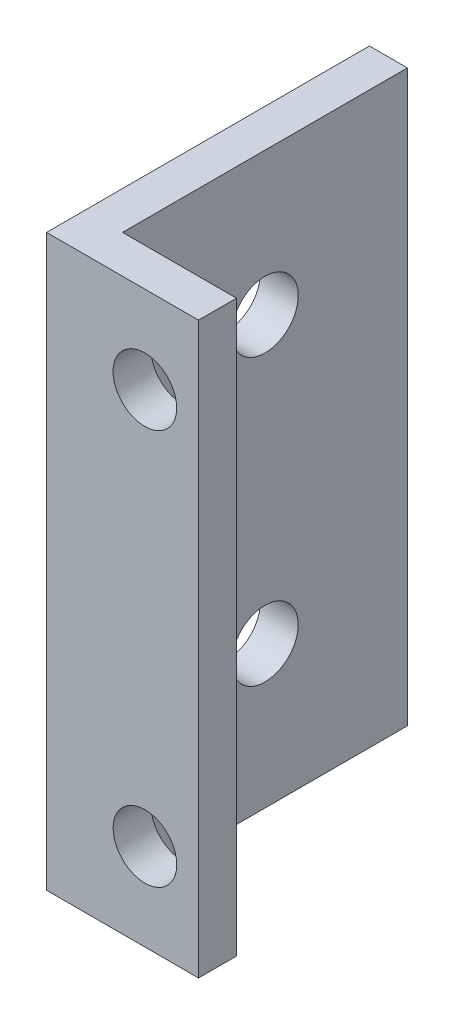
ISO-10303-21;
HEADER;
FILE_DESCRIPTION(('STEP AP214'),'2;1');
FILE_NAME('part.step','',(''),(''),'','','');
FILE_SCHEMA(('AUTOMOTIVE_DESIGN { 1 0 10303 214 1 1 1 1 }'));
ENDSEC;
DATA;
#1=APPLICATION_CONTEXT('core data for automotive mechanical design processes');
#2=APPLICATION_PROTOCOL_DEFINITION('international standard','automotive_design',2000,#1);
#3=PRODUCT_CONTEXT('',#1,'mechanical');
#4=PRODUCT('Part','Part','',(#3));
#5=PRODUCT_RELATED_PRODUCT_CATEGORY('part','',(#4));
#6=PRODUCT_DEFINITION_FORMATION('','',#4);
#7=PRODUCT_DEFINITION_CONTEXT('part definition',#1,'design');
#8=PRODUCT_DEFINITION('design','',#6,#7);
#9=PRODUCT_DEFINITION_SHAPE('','',#8);
#10=(LENGTH_UNIT() NAMED_UNIT(*) SI_UNIT(.MILLI.,.METRE.));
#11=(NAMED_UNIT(*) PLANE_ANGLE_UNIT() SI_UNIT($,.RADIAN.));
#12=(NAMED_UNIT(*) SI_UNIT($,.STERADIAN.) SOLID_ANGLE_UNIT());
#13=UNCERTAINTY_MEASURE_WITH_UNIT(LENGTH_MEASURE(1.E-05),#10,'distance_accuracy_value','');
#14=(GEOMETRIC_REPRESENTATION_CONTEXT(3) GLOBAL_UNCERTAINTY_ASSIGNED_CONTEXT((#13)) GLOBAL_UNIT_ASSIGNED_CONTEXT((#10,
#11,#12)) REPRESENTATION_CONTEXT('',''));
#15=CARTESIAN_POINT('',(0.,0.,0.));
#16=DIRECTION('',(0.,0.,1.));
#17=DIRECTION('',(1.,0.,0.));
#18=AXIS2_PLACEMENT_3D('',#15,#16,#17);
#19=CARTESIAN_POINT('',(3.46389011962785,30.,4.26030128489141));
#20=DIRECTION('',(-1.,0.,0.));
#21=DIRECTION('',(0.,0.,1.));
#22=AXIS2_PLACEMENT_3D('',#19,#20,#21);
#23=PLANE('',#22);
#24=DIRECTION('',(0.,0.,-1.));
#25=VECTOR('',#24,1.);
#26=CARTESIAN_POINT('',(3.46389011962785,0.,4.26030128489141));
#27=LINE('',#26,#25);
#28=CARTESIAN_POINT('',(3.46389011962785,0.,6.26030128489141));
#29=VERTEX_POINT('',#28);
#30=CARTESIAN_POINT('',(3.46389011962785,0.,4.26030128489141));
#31=VERTEX_POINT('',#30);
#32=EDGE_CURVE('E119',#29,#31,#27,.T.);
#33=ORIENTED_EDGE('',*,*,#32,.T.);
#34=DIRECTION('',(0.,-1.,0.));
#35=VECTOR('',#34,1.);
#36=CARTESIAN_POINT('',(3.46389011962785,30.,4.26030128489141));
#37=LINE('',#36,#35);
#38=CARTESIAN_POINT('',(3.46389011962785,30.,4.26030128489141));
#39=VERTEX_POINT('',#38);
#40=EDGE_CURVE('E11',#39,#31,#37,.T.);
#41=ORIENTED_EDGE('',*,*,#40,.F.);
#42=DIRECTION('',(0.,0.,-1.));
#43=VECTOR('',#42,1.);
#44=CARTESIAN_POINT('',(3.46389011962785,30.,4.26030128489141));
#45=LINE('',#44,#43);
#46=CARTESIAN_POINT('',(3.46389011962785,30.,6.26030128489141));
#47=VERTEX_POINT('',#46);
#48=EDGE_CURVE('E130',#47,#39,#45,.T.);
#49=ORIENTED_EDGE('',*,*,#48,.F.);
#50=DIRECTION('',(0.,-1.,0.));
#51=VECTOR('',#50,1.);
#52=CARTESIAN_POINT('',(3.46389011962785,30.,6.26030128489141));
#53=LINE('',#52,#51);
#54=EDGE_CURVE('E115',#47,#29,#53,.T.);
#55=ORIENTED_EDGE('',*,*,#54,.T.);
#56=EDGE_LOOP('',(#33,#41,#49,#55));
#57=FACE_BOUND('',#56,.T.);
#58=ADVANCED_FACE('F33',(#57),#23,.F.);
#59=CARTESIAN_POINT('',(-2.53610988037215,30.,4.26030128489141));
#60=DIRECTION('',(0.,0.,1.));
#61=DIRECTION('',(1.,0.,0.));
#62=AXIS2_PLACEMENT_3D('',#59,#60,#61);
#63=PLANE('',#62);
#64=CARTESIAN_POINT('',(0.643890119627849,4.59,4.26030128489141));
#65=DIRECTION('',(0.,0.,-1.));
#66=DIRECTION('',(-1.,0.,0.));
#67=AXIS2_PLACEMENT_3D('',#64,#65,#66);
#68=CIRCLE('',#67,1.675);
#69=CARTESIAN_POINT('',(-1.03110988037215,4.59,4.26030128489141));
#70=VERTEX_POINT('',#69);
#71=EDGE_CURVE('E141',#70,#70,#68,.T.);
#72=ORIENTED_EDGE('',*,*,#71,.F.);
#73=EDGE_LOOP('',(#72));
#74=FACE_BOUND('',#73,.T.);
#75=CARTESIAN_POINT('',(0.63889011962785,25.414,4.26030128489141));
#76=DIRECTION('',(0.,0.,-1.));
#77=DIRECTION('',(-1.,0.,0.));
#78=AXIS2_PLACEMENT_3D('',#75,#76,#77);
#79=CIRCLE('',#78,1.675);
#80=CARTESIAN_POINT('',(-1.03610988037215,25.414,4.26030128489141));
#81=VERTEX_POINT('',#80);
#82=EDGE_CURVE('E138',#81,#81,#79,.T.);
#83=ORIENTED_EDGE('',*,*,#82,.F.);
#84=EDGE_LOOP('',(#83));
#85=FACE_BOUND('',#84,.T.);
#86=DIRECTION('',(-1.,0.,0.));
#87=VECTOR('',#86,1.);
#88=CARTESIAN_POINT('',(-2.53610988037215,0.,4.26030128489141));
#89=LINE('',#88,#87);
#90=CARTESIAN_POINT('',(-2.53610988037215,0.,4.26030128489141));
#91=VERTEX_POINT('',#90);
#92=EDGE_CURVE('E122',#31,#91,#89,.T.);
#93=ORIENTED_EDGE('',*,*,#92,.T.);
#94=DIRECTION('',(0.,-1.,0.));
#95=VECTOR('',#94,1.);
#96=CARTESIAN_POINT('',(-2.53610988037215,30.,4.26030128489141));
#97=LINE('',#96,#95);
#98=CARTESIAN_POINT('',(-2.53610988037215,30.,4.26030128489141));
#99=VERTEX_POINT('',#98);
#100=EDGE_CURVE('E42',#99,#91,#97,.T.);
#101=ORIENTED_EDGE('',*,*,#100,.F.);
#102=DIRECTION('',(-1.,0.,0.));
#103=VECTOR('',#102,1.);
#104=CARTESIAN_POINT('',(-2.53610988037215,30.,4.26030128489141));
#105=LINE('',#104,#103);
#106=EDGE_CURVE('E88',#39,#99,#105,.T.);
#107=ORIENTED_EDGE('',*,*,#106,.F.);
#108=ORIENTED_EDGE('',*,*,#40,.T.);
#109=EDGE_LOOP('',(#93,#101,#107,#108));
#110=FACE_BOUND('',#109,.T.);
#111=ADVANCED_FACE('F162',(#74,#85,#110),#63,.F.);
#112=CARTESIAN_POINT('',(-2.53610988037215,30.,-10.7396987151086));
#113=DIRECTION('',(-1.,0.,0.));
#114=DIRECTION('',(0.,0.,1.));
#115=AXIS2_PLACEMENT_3D('',#112,#113,#114);
#116=PLANE('',#115);
#117=CARTESIAN_POINT('',(-2.53610988037215,7.5,-3.23969871510859));
#118=DIRECTION('',(1.,0.,0.));
#119=DIRECTION('',(0.,0.,-1.));
#120=AXIS2_PLACEMENT_3D('',#117,#118,#119);
#121=CIRCLE('',#120,1.75);
#122=CARTESIAN_POINT('',(-2.53610988037215,7.5,-4.98969871510859));
#123=VERTEX_POINT('',#122);
#124=EDGE_CURVE('E154',#123,#123,#121,.T.);
#125=ORIENTED_EDGE('',*,*,#124,.F.);
#126=EDGE_LOOP('',(#125));
#127=FACE_BOUND('',#126,.T.);
#128=CARTESIAN_POINT('',(-2.53610988037215,22.5,-3.23969871510859));
#129=DIRECTION('',(1.,0.,0.));
#130=DIRECTION('',(0.,0.,-1.));
#131=AXIS2_PLACEMENT_3D('',#128,#129,#130);
#132=CIRCLE('',#131,1.75);
#133=CARTESIAN_POINT('',(-2.53610988037215,22.5,-4.98969871510859));
#134=VERTEX_POINT('',#133);
#135=EDGE_CURVE('E144',#134,#134,#132,.T.);
#136=ORIENTED_EDGE('',*,*,#135,.F.);
#137=EDGE_LOOP('',(#136));
#138=FACE_BOUND('',#137,.T.);
#139=DIRECTION('',(0.,0.,-1.));
#140=VECTOR('',#139,1.);
#141=CARTESIAN_POINT('',(-2.53610988037215,0.,-10.7396987151086));
#142=LINE('',#141,#140);
#143=CARTESIAN_POINT('',(-2.53610988037215,0.,-10.7396987151086));
#144=VERTEX_POINT('',#143);
#145=EDGE_CURVE('E125',#91,#144,#142,.T.);
#146=ORIENTED_EDGE('',*,*,#145,.T.);
#147=DIRECTION('',(0.,-1.,0.));
#148=VECTOR('',#147,1.);
#149=CARTESIAN_POINT('',(-2.53610988037215,30.,-10.7396987151086));
#150=LINE('',#149,#148);
#151=CARTESIAN_POINT('',(-2.53610988037215,30.,-10.7396987151086));
#152=VERTEX_POINT('',#151);
#153=EDGE_CURVE('E110',#152,#144,#150,.T.);
#154=ORIENTED_EDGE('',*,*,#153,.F.);
#155=DIRECTION('',(0.,0.,-1.));
#156=VECTOR('',#155,1.);
#157=CARTESIAN_POINT('',(-2.53610988037215,30.,-10.7396987151086));
#158=LINE('',#157,#156);
#159=EDGE_CURVE('E101',#99,#152,#158,.T.);
#160=ORIENTED_EDGE('',*,*,#159,.F.);
#161=ORIENTED_EDGE('',*,*,#100,.T.);
#162=EDGE_LOOP('',(#146,#154,#160,#161));
#163=FACE_BOUND('',#162,.T.);
#164=ADVANCED_FACE('F165',(#127,#138,#163),#116,.F.);
#165=CARTESIAN_POINT('',(-4.53610988037215,30.,-10.7396987151086));
#166=DIRECTION('',(0.,0.,1.));
#167=DIRECTION('',(1.,0.,0.));
#168=AXIS2_PLACEMENT_3D('',#165,#166,#167);
#169=PLANE('',#168);
#170=DIRECTION('',(-1.,0.,0.));
#171=VECTOR('',#170,1.);
#172=CARTESIAN_POINT('',(-4.53610988037215,0.,-10.7396987151086));
#173=LINE('',#172,#171);
#174=CARTESIAN_POINT('',(-4.53610988037215,0.,-10.7396987151086));
#175=VERTEX_POINT('',#174);
#176=EDGE_CURVE('E109',#144,#175,#173,.T.);
#177=ORIENTED_EDGE('',*,*,#176,.T.);
#178=DIRECTION('',(0.,-1.,0.));
#179=VECTOR('',#178,1.);
#180=CARTESIAN_POINT('',(-4.53610988037215,30.,-10.7396987151086));
#181=LINE('',#180,#179);
#182=CARTESIAN_POINT('',(-4.53610988037215,30.,-10.7396987151086));
#183=VERTEX_POINT('',#182);
#184=EDGE_CURVE('E106',#183,#175,#181,.T.);
#185=ORIENTED_EDGE('',*,*,#184,.F.);
#186=DIRECTION('',(-1.,0.,0.));
#187=VECTOR('',#186,1.);
#188=CARTESIAN_POINT('',(-4.53610988037215,30.,-10.7396987151086));
#189=LINE('',#188,#187);
#190=EDGE_CURVE('E95',#152,#183,#189,.T.);
#191=ORIENTED_EDGE('',*,*,#190,.F.);
#192=ORIENTED_EDGE('',*,*,#153,.T.);
#193=EDGE_LOOP('',(#177,#185,#191,#192));
#194=FACE_BOUND('',#193,.T.);
#195=ADVANCED_FACE('F107',(#194),#169,.F.);
#196=CARTESIAN_POINT('',(-4.53610988037215,30.,-10.7396987151086));
#197=DIRECTION('',(1.,0.,0.));
#198=DIRECTION('',(0.,0.,-1.));
#199=AXIS2_PLACEMENT_3D('',#196,#197,#198);
#200=PLANE('',#199);
#201=CARTESIAN_POINT('',(-4.53610988037215,7.5,-3.23969871510859));
#202=DIRECTION('',(1.,0.,0.));
#203=DIRECTION('',(0.,0.,-1.));
#204=AXIS2_PLACEMENT_3D('',#201,#202,#203);
#205=CIRCLE('',#204,1.75);
#206=CARTESIAN_POINT('',(-4.53610988037215,7.5,-4.98969871510859));
#207=VERTEX_POINT('',#206);
#208=EDGE_CURVE('E36',#207,#207,#205,.T.);
#209=ORIENTED_EDGE('',*,*,#208,.T.);
#210=EDGE_LOOP('',(#209));
#211=FACE_BOUND('',#210,.T.);
#212=CARTESIAN_POINT('',(-4.53610988037215,22.5,-3.23969871510859));
#213=DIRECTION('',(1.,0.,0.));
#214=DIRECTION('',(0.,0.,-1.));
#215=AXIS2_PLACEMENT_3D('',#212,#213,#214);
#216=CIRCLE('',#215,1.75);
#217=CARTESIAN_POINT('',(-4.53610988037215,22.5,-4.98969871510859));
#218=VERTEX_POINT('',#217);
#219=EDGE_CURVE('E142',#218,#218,#216,.T.);
#220=ORIENTED_EDGE('',*,*,#219,.T.);
#221=EDGE_LOOP('',(#220));
#222=FACE_BOUND('',#221,.T.);
#223=DIRECTION('',(0.,0.,1.));
#224=VECTOR('',#223,1.);
#225=CARTESIAN_POINT('',(-4.53610988037215,0.,-10.7396987151086));
#226=LINE('',#225,#224);
#227=CARTESIAN_POINT('',(-4.53610988037215,0.,6.26030128489141));
#228=VERTEX_POINT('',#227);
#229=EDGE_CURVE('E74',#175,#228,#226,.T.);
#230=ORIENTED_EDGE('',*,*,#229,.T.);
#231=DIRECTION('',(0.,-1.,0.));
#232=VECTOR('',#231,1.);
#233=CARTESIAN_POINT('',(-4.53610988037215,30.,6.26030128489141));
#234=LINE('',#233,#232);
#235=CARTESIAN_POINT('',(-4.53610988037215,30.,6.26030128489141));
#236=VERTEX_POINT('',#235);
#237=EDGE_CURVE('E111',#236,#228,#234,.T.);
#238=ORIENTED_EDGE('',*,*,#237,.F.);
#239=DIRECTION('',(0.,0.,1.));
#240=VECTOR('',#239,1.);
#241=CARTESIAN_POINT('',(-4.53610988037215,30.,-10.7396987151086));
#242=LINE('',#241,#240);
#243=EDGE_CURVE('E99',#183,#236,#242,.T.);
#244=ORIENTED_EDGE('',*,*,#243,.F.);
#245=ORIENTED_EDGE('',*,*,#184,.T.);
#246=EDGE_LOOP('',(#230,#238,#244,#245));
#247=FACE_BOUND('',#246,.T.);
#248=ADVANCED_FACE('F113',(#211,#222,#247),#200,.F.);
#249=CARTESIAN_POINT('',(-4.53610988037215,30.,6.26030128489141));
#250=DIRECTION('',(0.,0.,-1.));
#251=DIRECTION('',(-1.,0.,0.));
#252=AXIS2_PLACEMENT_3D('',#249,#250,#251);
#253=PLANE('',#252);
#254=CARTESIAN_POINT('',(0.643890119627849,4.59,6.26030128489141));
#255=DIRECTION('',(0.,0.,-1.));
#256=DIRECTION('',(-1.,0.,0.));
#257=AXIS2_PLACEMENT_3D('',#254,#255,#256);
#258=CIRCLE('',#257,1.675);
#259=CARTESIAN_POINT('',(-1.03110988037215,4.59,6.26030128489141));
#260=VERTEX_POINT('',#259);
#261=EDGE_CURVE('E139',#260,#260,#258,.T.);
#262=ORIENTED_EDGE('',*,*,#261,.T.);
#263=EDGE_LOOP('',(#262));
#264=FACE_BOUND('',#263,.T.);
#265=CARTESIAN_POINT('',(0.63889011962785,25.414,6.26030128489141));
#266=DIRECTION('',(0.,0.,-1.));
#267=DIRECTION('',(-1.,0.,0.));
#268=AXIS2_PLACEMENT_3D('',#265,#266,#267);
#269=CIRCLE('',#268,1.675);
#270=CARTESIAN_POINT('',(-1.03610988037215,25.414,6.26030128489141));
#271=VERTEX_POINT('',#270);
#272=EDGE_CURVE('E123',#271,#271,#269,.T.);
#273=ORIENTED_EDGE('',*,*,#272,.T.);
#274=EDGE_LOOP('',(#273));
#275=FACE_BOUND('',#274,.T.);
#276=DIRECTION('',(1.,0.,0.));
#277=VECTOR('',#276,1.);
#278=CARTESIAN_POINT('',(-4.53610988037215,0.,6.26030128489141));
#279=LINE('',#278,#277);
#280=EDGE_CURVE('E80',#228,#29,#279,.T.);
#281=ORIENTED_EDGE('',*,*,#280,.T.);
#282=ORIENTED_EDGE('',*,*,#54,.F.);
#283=DIRECTION('',(1.,0.,0.));
#284=VECTOR('',#283,1.);
#285=CARTESIAN_POINT('',(-4.53610988037215,30.,6.26030128489141));
#286=LINE('',#285,#284);
#287=EDGE_CURVE('E51',#236,#47,#286,.T.);
#288=ORIENTED_EDGE('',*,*,#287,.F.);
#289=ORIENTED_EDGE('',*,*,#237,.T.);
#290=EDGE_LOOP('',(#281,#282,#288,#289));
#291=FACE_BOUND('',#290,.T.);
#292=ADVANCED_FACE('F170',(#264,#275,#291),#253,.F.);
#293=CARTESIAN_POINT('',(0.,30.,0.));
#294=DIRECTION('',(0.,1.,0.));
#295=DIRECTION('',(0.,0.,1.));
#296=AXIS2_PLACEMENT_3D('',#293,#294,#295);
#297=PLANE('',#296);
#298=ORIENTED_EDGE('',*,*,#48,.T.);
#299=ORIENTED_EDGE('',*,*,#106,.T.);
#300=ORIENTED_EDGE('',*,*,#159,.T.);
#301=ORIENTED_EDGE('',*,*,#190,.T.);
#302=ORIENTED_EDGE('',*,*,#243,.T.);
#303=ORIENTED_EDGE('',*,*,#287,.T.);
#304=EDGE_LOOP('',(#298,#299,#300,#301,#302,#303));
#305=FACE_BOUND('',#304,.T.);
#306=ADVANCED_FACE('F97',(#305),#297,.T.);
#307=CARTESIAN_POINT('',(0.,0.,0.));
#308=DIRECTION('',(0.,1.,0.));
#309=DIRECTION('',(0.,0.,1.));
#310=AXIS2_PLACEMENT_3D('',#307,#308,#309);
#311=PLANE('',#310);
#312=ORIENTED_EDGE('',*,*,#32,.F.);
#313=ORIENTED_EDGE('',*,*,#280,.F.);
#314=ORIENTED_EDGE('',*,*,#229,.F.);
#315=ORIENTED_EDGE('',*,*,#176,.F.);
#316=ORIENTED_EDGE('',*,*,#145,.F.);
#317=ORIENTED_EDGE('',*,*,#92,.F.);
#318=EDGE_LOOP('',(#312,#313,#314,#315,#316,#317));
#319=FACE_BOUND('',#318,.T.);
#320=ADVANCED_FACE('F168',(#319),#311,.F.);
#321=CARTESIAN_POINT('',(0.63889011962785,25.414,34.2603012848914));
#322=DIRECTION('',(0.,0.,-1.));
#323=DIRECTION('',(-1.,0.,0.));
#324=AXIS2_PLACEMENT_3D('',#321,#322,#323);
#325=CYLINDRICAL_SURFACE('',#324,1.675);
#326=ORIENTED_EDGE('',*,*,#82,.T.);
#327=EDGE_LOOP('',(#326));
#328=FACE_BOUND('',#327,.T.);
#329=ORIENTED_EDGE('',*,*,#272,.F.);
#330=EDGE_LOOP('',(#329));
#331=FACE_BOUND('',#330,.T.);
#332=ADVANCED_FACE('F240',(#328,#331),#325,.F.);
#333=CARTESIAN_POINT('',(0.643890119627849,4.59,34.2603012848914));
#334=DIRECTION('',(0.,0.,-1.));
#335=DIRECTION('',(-1.,0.,0.));
#336=AXIS2_PLACEMENT_3D('',#333,#334,#335);
#337=CYLINDRICAL_SURFACE('',#336,1.675);
#338=ORIENTED_EDGE('',*,*,#71,.T.);
#339=EDGE_LOOP('',(#338));
#340=FACE_BOUND('',#339,.T.);
#341=ORIENTED_EDGE('',*,*,#261,.F.);
#342=EDGE_LOOP('',(#341));
#343=FACE_BOUND('',#342,.T.);
#344=ADVANCED_FACE('F221',(#340,#343),#337,.F.);
#345=CARTESIAN_POINT('',(-32.5361098803722,22.5,-3.23969871510859));
#346=DIRECTION('',(1.,0.,0.));
#347=DIRECTION('',(0.,0.,-1.));
#348=AXIS2_PLACEMENT_3D('',#345,#346,#347);
#349=CYLINDRICAL_SURFACE('',#348,1.75);
#350=ORIENTED_EDGE('',*,*,#135,.T.);
#351=EDGE_LOOP('',(#350));
#352=FACE_BOUND('',#351,.T.);
#353=ORIENTED_EDGE('',*,*,#219,.F.);
#354=EDGE_LOOP('',(#353));
#355=FACE_BOUND('',#354,.T.);
#356=ADVANCED_FACE('F215',(#352,#355),#349,.F.);
#357=CARTESIAN_POINT('',(-32.5361098803722,7.5,-3.23969871510859));
#358=DIRECTION('',(1.,0.,0.));
#359=DIRECTION('',(0.,0.,-1.));
#360=AXIS2_PLACEMENT_3D('',#357,#358,#359);
#361=CYLINDRICAL_SURFACE('',#360,1.75);
#362=ORIENTED_EDGE('',*,*,#124,.T.);
#363=EDGE_LOOP('',(#362));
#364=FACE_BOUND('',#363,.T.);
#365=ORIENTED_EDGE('',*,*,#208,.F.);
#366=EDGE_LOOP('',(#365));
#367=FACE_BOUND('',#366,.T.);
#368=ADVANCED_FACE('F220',(#364,#367),#361,.F.);
#369=CLOSED_SHELL('',(#58,#111,#164,#195,#248,#292,#306,#320,#332,#344,#356,#368));
#370=MANIFOLD_SOLID_BREP('B2',#369);
#371=ADVANCED_BREP_SHAPE_REPRESENTATION('',(#18,#370),#14);
#372=SHAPE_DEFINITION_REPRESENTATION(#9,#371);
ENDSEC;
END-ISO-10303-21;
